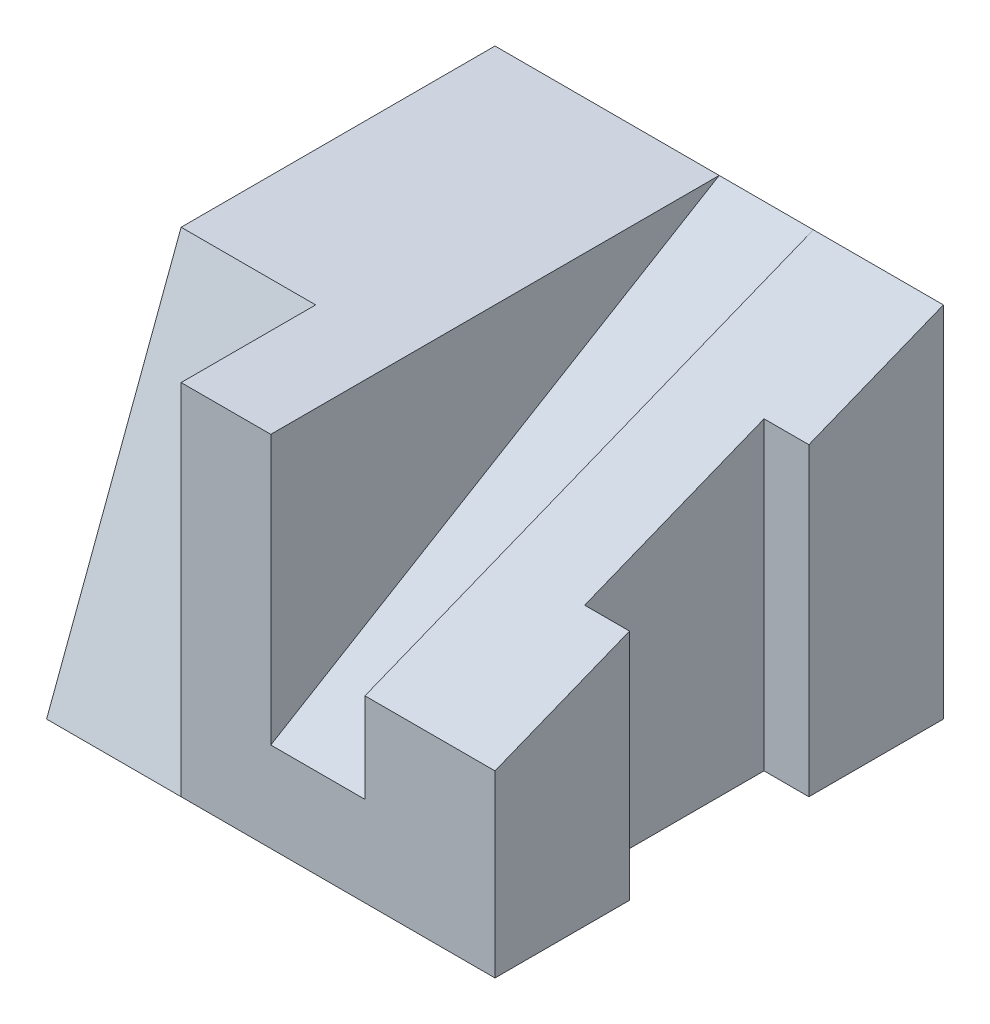
ISO-10303-21;
HEADER;
FILE_DESCRIPTION(('STEP AP214'),'2;1');
FILE_NAME('part.step','',(''),(''),'','','');
FILE_SCHEMA(('AUTOMOTIVE_DESIGN { 1 0 10303 214 1 1 1 1 }'));
ENDSEC;
DATA;
#1=APPLICATION_CONTEXT('core data for automotive mechanical design processes');
#2=APPLICATION_PROTOCOL_DEFINITION('international standard','automotive_design',2000,#1);
#3=PRODUCT_CONTEXT('',#1,'mechanical');
#4=PRODUCT('Part','Part','',(#3));
#5=PRODUCT_RELATED_PRODUCT_CATEGORY('part','',(#4));
#6=PRODUCT_DEFINITION_FORMATION('','',#4);
#7=PRODUCT_DEFINITION_CONTEXT('part definition',#1,'design');
#8=PRODUCT_DEFINITION('design','',#6,#7);
#9=PRODUCT_DEFINITION_SHAPE('','',#8);
#10=(LENGTH_UNIT() NAMED_UNIT(*) SI_UNIT(.MILLI.,.METRE.));
#11=(NAMED_UNIT(*) PLANE_ANGLE_UNIT() SI_UNIT($,.RADIAN.));
#12=(NAMED_UNIT(*) SI_UNIT($,.STERADIAN.) SOLID_ANGLE_UNIT());
#13=UNCERTAINTY_MEASURE_WITH_UNIT(LENGTH_MEASURE(1.E-05),#10,'distance_accuracy_value','');
#14=(GEOMETRIC_REPRESENTATION_CONTEXT(3) GLOBAL_UNCERTAINTY_ASSIGNED_CONTEXT((#13)) GLOBAL_UNIT_ASSIGNED_CONTEXT((#10,
#11,#12)) REPRESENTATION_CONTEXT('',''));
#15=CARTESIAN_POINT('',(0.,0.,0.));
#16=DIRECTION('',(0.,0.,1.));
#17=DIRECTION('',(1.,0.,0.));
#18=AXIS2_PLACEMENT_3D('',#15,#16,#17);
#19=CARTESIAN_POINT('',(100.,0.,-100.));
#20=DIRECTION('',(1.,0.,0.));
#21=DIRECTION('',(0.,0.,-1.));
#22=AXIS2_PLACEMENT_3D('',#19,#20,#21);
#23=PLANE('',#22);
#24=DIRECTION('',(0.,1.,0.));
#25=VECTOR('',#24,1.);
#26=CARTESIAN_POINT('',(100.,0.,-70.));
#27=LINE('',#26,#25);
#28=CARTESIAN_POINT('',(100.,0.,-70.));
#29=VERTEX_POINT('',#28);
#30=CARTESIAN_POINT('',(100.,68.,-70.));
#31=VERTEX_POINT('',#30);
#32=EDGE_CURVE('E154',#29,#31,#27,.T.);
#33=ORIENTED_EDGE('',*,*,#32,.F.);
#34=DIRECTION('',(0.,0.,1.));
#35=VECTOR('',#34,1.);
#36=CARTESIAN_POINT('',(100.,0.,-100.));
#37=LINE('',#36,#35);
#38=CARTESIAN_POINT('',(100.,0.,-100.));
#39=VERTEX_POINT('',#38);
#40=EDGE_CURVE('E51',#39,#29,#37,.T.);
#41=ORIENTED_EDGE('',*,*,#40,.F.);
#42=DIRECTION('',(0.,1.,0.));
#43=VECTOR('',#42,1.);
#44=CARTESIAN_POINT('',(100.,0.,-100.));
#45=LINE('',#44,#43);
#46=CARTESIAN_POINT('',(100.,80.,-100.));
#47=VERTEX_POINT('',#46);
#48=EDGE_CURVE('E228',#39,#47,#45,.T.);
#49=ORIENTED_EDGE('',*,*,#48,.T.);
#50=DIRECTION('',(0.,0.371390676354104,-0.928476690885259));
#51=VECTOR('',#50,1.);
#52=CARTESIAN_POINT('',(100.,40.,0.));
#53=LINE('',#52,#51);
#54=EDGE_CURVE('E192',#31,#47,#53,.T.);
#55=ORIENTED_EDGE('',*,*,#54,.F.);
#56=EDGE_LOOP('',(#33,#41,#49,#55));
#57=FACE_BOUND('',#56,.T.);
#58=ADVANCED_FACE('F41',(#57),#23,.T.);
#59=CARTESIAN_POINT('',(0.,0.,0.));
#60=DIRECTION('',(0.,0.,-1.));
#61=DIRECTION('',(-1.,0.,0.));
#62=AXIS2_PLACEMENT_3D('',#59,#60,#61);
#63=PLANE('',#62);
#64=DIRECTION('',(0.,-1.,0.));
#65=VECTOR('',#64,1.);
#66=CARTESIAN_POINT('',(71.,40.,0.));
#67=LINE('',#66,#65);
#68=CARTESIAN_POINT('',(71.,40.,0.));
#69=VERTEX_POINT('',#68);
#70=CARTESIAN_POINT('',(71.,20.,0.));
#71=VERTEX_POINT('',#70);
#72=EDGE_CURVE('E172',#69,#71,#67,.T.);
#73=ORIENTED_EDGE('',*,*,#72,.T.);
#74=DIRECTION('',(-1.,0.,0.));
#75=VECTOR('',#74,1.);
#76=CARTESIAN_POINT('',(71.,20.,0.));
#77=LINE('',#76,#75);
#78=CARTESIAN_POINT('',(50.,20.,0.));
#79=VERTEX_POINT('',#78);
#80=EDGE_CURVE('E188',#71,#79,#77,.T.);
#81=ORIENTED_EDGE('',*,*,#80,.T.);
#82=DIRECTION('',(0.,-1.,0.));
#83=VECTOR('',#82,1.);
#84=CARTESIAN_POINT('',(50.,80.,0.));
#85=LINE('',#84,#83);
#86=CARTESIAN_POINT('',(50.,80.,0.));
#87=VERTEX_POINT('',#86);
#88=EDGE_CURVE('E193',#87,#79,#85,.T.);
#89=ORIENTED_EDGE('',*,*,#88,.F.);
#90=DIRECTION('',(-1.,0.,0.));
#91=VECTOR('',#90,1.);
#92=CARTESIAN_POINT('',(0.,80.,0.));
#93=LINE('',#92,#91);
#94=CARTESIAN_POINT('',(30.,80.,0.));
#95=VERTEX_POINT('',#94);
#96=EDGE_CURVE('E224',#87,#95,#93,.T.);
#97=ORIENTED_EDGE('',*,*,#96,.T.);
#98=DIRECTION('',(0.,1.,0.));
#99=VECTOR('',#98,1.);
#100=CARTESIAN_POINT('',(30.,80.,0.));
#101=LINE('',#100,#99);
#102=CARTESIAN_POINT('',(30.,0.,0.));
#103=VERTEX_POINT('',#102);
#104=EDGE_CURVE('E205',#103,#95,#101,.T.);
#105=ORIENTED_EDGE('',*,*,#104,.F.);
#106=DIRECTION('',(1.,0.,0.));
#107=VECTOR('',#106,1.);
#108=CARTESIAN_POINT('',(0.,0.,0.));
#109=LINE('',#108,#107);
#110=CARTESIAN_POINT('',(100.,0.,0.));
#111=VERTEX_POINT('',#110);
#112=EDGE_CURVE('E218',#103,#111,#109,.T.);
#113=ORIENTED_EDGE('',*,*,#112,.T.);
#114=DIRECTION('',(0.,1.,0.));
#115=VECTOR('',#114,1.);
#116=CARTESIAN_POINT('',(100.,0.,0.));
#117=LINE('',#116,#115);
#118=CARTESIAN_POINT('',(100.,40.,0.));
#119=VERTEX_POINT('',#118);
#120=EDGE_CURVE('E240',#111,#119,#117,.T.);
#121=ORIENTED_EDGE('',*,*,#120,.T.);
#122=DIRECTION('',(1.,0.,0.));
#123=VECTOR('',#122,1.);
#124=CARTESIAN_POINT('',(50.,40.,0.));
#125=LINE('',#124,#123);
#126=EDGE_CURVE('E199',#69,#119,#125,.T.);
#127=ORIENTED_EDGE('',*,*,#126,.F.);
#128=EDGE_LOOP('',(#73,#81,#89,#97,#105,#113,#121,#127));
#129=FACE_BOUND('',#128,.T.);
#130=ADVANCED_FACE('F268',(#129),#63,.F.);
#131=CARTESIAN_POINT('',(50.,40.,0.));
#132=DIRECTION('',(0.,-0.928476690885259,-0.371390676354104));
#133=DIRECTION('',(0.,0.371390676354104,-0.92847669088526));
#134=AXIS2_PLACEMENT_3D('',#131,#132,#133);
#135=PLANE('',#134);
#136=DIRECTION('',(0.,-0.371390676354104,0.928476690885259));
#137=VECTOR('',#136,1.);
#138=CARTESIAN_POINT('',(90.,68.,-70.));
#139=LINE('',#138,#137);
#140=CARTESIAN_POINT('',(90.,68.,-70.));
#141=VERTEX_POINT('',#140);
#142=CARTESIAN_POINT('',(90.,52.,-30.));
#143=VERTEX_POINT('',#142);
#144=EDGE_CURVE('E144',#141,#143,#139,.T.);
#145=ORIENTED_EDGE('',*,*,#144,.F.);
#146=DIRECTION('',(1.,0.,0.));
#147=VECTOR('',#146,1.);
#148=CARTESIAN_POINT('',(90.,68.,-70.));
#149=LINE('',#148,#147);
#150=EDGE_CURVE('E173',#141,#31,#149,.T.);
#151=ORIENTED_EDGE('',*,*,#150,.T.);
#152=ORIENTED_EDGE('',*,*,#54,.T.);
#153=DIRECTION('',(-1.,0.,0.));
#154=VECTOR('',#153,1.);
#155=CARTESIAN_POINT('',(0.,80.,-100.));
#156=LINE('',#155,#154);
#157=CARTESIAN_POINT('',(71.,80.,-100.));
#158=VERTEX_POINT('',#157);
#159=EDGE_CURVE('E233',#47,#158,#156,.T.);
#160=ORIENTED_EDGE('',*,*,#159,.T.);
#161=DIRECTION('',(0.,-0.371390676354104,0.928476690885259));
#162=VECTOR('',#161,1.);
#163=CARTESIAN_POINT('',(71.,80.,-100.));
#164=LINE('',#163,#162);
#165=EDGE_CURVE('E180',#158,#69,#164,.T.);
#166=ORIENTED_EDGE('',*,*,#165,.T.);
#167=ORIENTED_EDGE('',*,*,#126,.T.);
#168=CARTESIAN_POINT('',(100.,52.,-30.));
#169=VERTEX_POINT('',#168);
#170=EDGE_CURVE('E159',#119,#169,#53,.T.);
#171=ORIENTED_EDGE('',*,*,#170,.T.);
#172=DIRECTION('',(1.,0.,0.));
#173=VECTOR('',#172,1.);
#174=CARTESIAN_POINT('',(90.,52.,-30.));
#175=LINE('',#174,#173);
#176=EDGE_CURVE('E137',#143,#169,#175,.T.);
#177=ORIENTED_EDGE('',*,*,#176,.F.);
#178=EDGE_LOOP('',(#145,#151,#152,#160,#166,#167,#171,#177));
#179=FACE_BOUND('',#178,.T.);
#180=ADVANCED_FACE('F157',(#179),#135,.F.);
#181=CARTESIAN_POINT('',(0.,0.,-100.));
#182=DIRECTION('',(-1.,0.,0.));
#183=DIRECTION('',(0.,0.,1.));
#184=AXIS2_PLACEMENT_3D('',#181,#182,#183);
#185=PLANE('',#184);
#186=DIRECTION('',(0.,-0.936329177569045,0.351123441588392));
#187=VECTOR('',#186,1.);
#188=CARTESIAN_POINT('',(0.,0.,0.));
#189=LINE('',#188,#187);
#190=CARTESIAN_POINT('',(0.,80.,-30.));
#191=VERTEX_POINT('',#190);
#192=CARTESIAN_POINT('',(0.,0.,0.));
#193=VERTEX_POINT('',#192);
#194=EDGE_CURVE('E204',#191,#193,#189,.T.);
#195=ORIENTED_EDGE('',*,*,#194,.F.);
#196=DIRECTION('',(0.,0.,1.));
#197=VECTOR('',#196,1.);
#198=CARTESIAN_POINT('',(0.,80.,-100.));
#199=LINE('',#198,#197);
#200=CARTESIAN_POINT('',(0.,80.,-100.));
#201=VERTEX_POINT('',#200);
#202=EDGE_CURVE('E11',#201,#191,#199,.T.);
#203=ORIENTED_EDGE('',*,*,#202,.F.);
#204=DIRECTION('',(0.,-1.,0.));
#205=VECTOR('',#204,1.);
#206=CARTESIAN_POINT('',(0.,0.,-100.));
#207=LINE('',#206,#205);
#208=CARTESIAN_POINT('',(0.,0.,-100.));
#209=VERTEX_POINT('',#208);
#210=EDGE_CURVE('E219',#201,#209,#207,.T.);
#211=ORIENTED_EDGE('',*,*,#210,.T.);
#212=DIRECTION('',(0.,0.,1.));
#213=VECTOR('',#212,1.);
#214=CARTESIAN_POINT('',(0.,0.,-100.));
#215=LINE('',#214,#213);
#216=EDGE_CURVE('E45',#209,#193,#215,.T.);
#217=ORIENTED_EDGE('',*,*,#216,.T.);
#218=EDGE_LOOP('',(#195,#203,#211,#217));
#219=FACE_BOUND('',#218,.T.);
#220=ADVANCED_FACE('F43',(#219),#185,.T.);
#221=CARTESIAN_POINT('',(0.,80.,-100.));
#222=DIRECTION('',(0.,1.,0.));
#223=DIRECTION('',(0.,0.,1.));
#224=AXIS2_PLACEMENT_3D('',#221,#222,#223);
#225=PLANE('',#224);
#226=DIRECTION('',(0.,0.,1.));
#227=VECTOR('',#226,1.);
#228=CARTESIAN_POINT('',(50.,80.,-100.));
#229=LINE('',#228,#227);
#230=CARTESIAN_POINT('',(50.,80.,-100.));
#231=VERTEX_POINT('',#230);
#232=EDGE_CURVE('E196',#231,#87,#229,.T.);
#233=ORIENTED_EDGE('',*,*,#232,.F.);
#234=EDGE_CURVE('E232',#231,#201,#156,.T.);
#235=ORIENTED_EDGE('',*,*,#234,.T.);
#236=ORIENTED_EDGE('',*,*,#202,.T.);
#237=DIRECTION('',(-1.,0.,0.));
#238=VECTOR('',#237,1.);
#239=CARTESIAN_POINT('',(30.,80.,-30.));
#240=LINE('',#239,#238);
#241=CARTESIAN_POINT('',(30.,80.,-30.));
#242=VERTEX_POINT('',#241);
#243=EDGE_CURVE('E213',#242,#191,#240,.T.);
#244=ORIENTED_EDGE('',*,*,#243,.F.);
#245=DIRECTION('',(0.,0.,-1.));
#246=VECTOR('',#245,1.);
#247=CARTESIAN_POINT('',(30.,80.,-30.));
#248=LINE('',#247,#246);
#249=EDGE_CURVE('E208',#95,#242,#248,.T.);
#250=ORIENTED_EDGE('',*,*,#249,.F.);
#251=ORIENTED_EDGE('',*,*,#96,.F.);
#252=EDGE_LOOP('',(#233,#235,#236,#244,#250,#251));
#253=FACE_BOUND('',#252,.T.);
#254=ADVANCED_FACE('F276',(#253),#225,.T.);
#255=DIRECTION('',(0.,-1.,0.));
#256=VECTOR('',#255,1.);
#257=CARTESIAN_POINT('',(100.,52.,-30.));
#258=LINE('',#257,#256);
#259=CARTESIAN_POINT('',(100.,0.,-30.));
#260=VERTEX_POINT('',#259);
#261=EDGE_CURVE('E288',#169,#260,#258,.T.);
#262=ORIENTED_EDGE('',*,*,#261,.F.);
#263=ORIENTED_EDGE('',*,*,#170,.F.);
#264=ORIENTED_EDGE('',*,*,#120,.F.);
#265=EDGE_CURVE('E247',#260,#111,#37,.T.);
#266=ORIENTED_EDGE('',*,*,#265,.F.);
#267=EDGE_LOOP('',(#262,#263,#264,#266));
#268=FACE_BOUND('',#267,.T.);
#269=ADVANCED_FACE('F299',(#268),#23,.T.);
#270=CARTESIAN_POINT('',(0.,0.,-100.));
#271=DIRECTION('',(0.,-1.,0.));
#272=DIRECTION('',(0.,0.,-1.));
#273=AXIS2_PLACEMENT_3D('',#270,#271,#272);
#274=PLANE('',#273);
#275=DIRECTION('',(1.,0.,0.));
#276=VECTOR('',#275,1.);
#277=CARTESIAN_POINT('',(90.,0.,-70.));
#278=LINE('',#277,#276);
#279=CARTESIAN_POINT('',(90.,0.,-70.));
#280=VERTEX_POINT('',#279);
#281=EDGE_CURVE('E164',#280,#29,#278,.T.);
#282=ORIENTED_EDGE('',*,*,#281,.F.);
#283=DIRECTION('',(0.,0.,-1.));
#284=VECTOR('',#283,1.);
#285=CARTESIAN_POINT('',(90.,0.,-30.));
#286=LINE('',#285,#284);
#287=CARTESIAN_POINT('',(90.,0.,-30.));
#288=VERTEX_POINT('',#287);
#289=EDGE_CURVE('E143',#288,#280,#286,.T.);
#290=ORIENTED_EDGE('',*,*,#289,.F.);
#291=DIRECTION('',(1.,0.,0.));
#292=VECTOR('',#291,1.);
#293=CARTESIAN_POINT('',(90.,0.,-30.));
#294=LINE('',#293,#292);
#295=EDGE_CURVE('E140',#288,#260,#294,.T.);
#296=ORIENTED_EDGE('',*,*,#295,.T.);
#297=ORIENTED_EDGE('',*,*,#265,.T.);
#298=ORIENTED_EDGE('',*,*,#112,.F.);
#299=EDGE_CURVE('E237',#193,#103,#109,.T.);
#300=ORIENTED_EDGE('',*,*,#299,.F.);
#301=ORIENTED_EDGE('',*,*,#216,.F.);
#302=DIRECTION('',(1.,0.,0.));
#303=VECTOR('',#302,1.);
#304=CARTESIAN_POINT('',(0.,0.,-100.));
#305=LINE('',#304,#303);
#306=EDGE_CURVE('E223',#209,#39,#305,.T.);
#307=ORIENTED_EDGE('',*,*,#306,.T.);
#308=ORIENTED_EDGE('',*,*,#40,.T.);
#309=EDGE_LOOP('',(#282,#290,#296,#297,#298,#300,#301,#307,#308));
#310=FACE_BOUND('',#309,.T.);
#311=ADVANCED_FACE('F262',(#310),#274,.T.);
#312=CARTESIAN_POINT('',(0.,0.,-100.));
#313=DIRECTION('',(0.,0.,-1.));
#314=DIRECTION('',(-1.,0.,0.));
#315=AXIS2_PLACEMENT_3D('',#312,#313,#314);
#316=PLANE('',#315);
#317=ORIENTED_EDGE('',*,*,#210,.F.);
#318=ORIENTED_EDGE('',*,*,#234,.F.);
#319=DIRECTION('',(-1.,0.,0.));
#320=VECTOR('',#319,1.);
#321=CARTESIAN_POINT('',(71.,80.,-100.));
#322=LINE('',#321,#320);
#323=EDGE_CURVE('E184',#158,#231,#322,.T.);
#324=ORIENTED_EDGE('',*,*,#323,.F.);
#325=ORIENTED_EDGE('',*,*,#159,.F.);
#326=ORIENTED_EDGE('',*,*,#48,.F.);
#327=ORIENTED_EDGE('',*,*,#306,.F.);
#328=EDGE_LOOP('',(#317,#318,#324,#325,#326,#327));
#329=FACE_BOUND('',#328,.T.);
#330=ADVANCED_FACE('F279',(#329),#316,.T.);
#331=CARTESIAN_POINT('',(30.,0.,0.));
#332=DIRECTION('',(0.,-0.351123441588392,-0.936329177569045));
#333=DIRECTION('',(0.,0.936329177569045,-0.351123441588392));
#334=AXIS2_PLACEMENT_3D('',#331,#332,#333);
#335=PLANE('',#334);
#336=ORIENTED_EDGE('',*,*,#194,.T.);
#337=ORIENTED_EDGE('',*,*,#299,.T.);
#338=DIRECTION('',(0.,-0.936329177569045,0.351123441588392));
#339=VECTOR('',#338,1.);
#340=CARTESIAN_POINT('',(30.,0.,0.));
#341=LINE('',#340,#339);
#342=EDGE_CURVE('E67',#242,#103,#341,.T.);
#343=ORIENTED_EDGE('',*,*,#342,.F.);
#344=ORIENTED_EDGE('',*,*,#243,.T.);
#345=EDGE_LOOP('',(#336,#337,#343,#344));
#346=FACE_BOUND('',#345,.T.);
#347=ADVANCED_FACE('F265',(#346),#335,.F.);
#348=CARTESIAN_POINT('',(30.,0.,0.));
#349=DIRECTION('',(-1.,0.,0.));
#350=DIRECTION('',(0.,0.,1.));
#351=AXIS2_PLACEMENT_3D('',#348,#349,#350);
#352=PLANE('',#351);
#353=ORIENTED_EDGE('',*,*,#104,.T.);
#354=ORIENTED_EDGE('',*,*,#249,.T.);
#355=ORIENTED_EDGE('',*,*,#342,.T.);
#356=EDGE_LOOP('',(#353,#354,#355));
#357=FACE_BOUND('',#356,.T.);
#358=ADVANCED_FACE('F273',(#357),#352,.T.);
#359=CARTESIAN_POINT('',(50.,0.,0.));
#360=DIRECTION('',(-1.,0.,0.));
#361=DIRECTION('',(0.,0.,1.));
#362=AXIS2_PLACEMENT_3D('',#359,#360,#361);
#363=PLANE('',#362);
#364=ORIENTED_EDGE('',*,*,#88,.T.);
#365=DIRECTION('',(0.,0.514495755427526,-0.857492925712544));
#366=VECTOR('',#365,1.);
#367=CARTESIAN_POINT('',(50.,20.,0.));
#368=LINE('',#367,#366);
#369=EDGE_CURVE('E169',#79,#231,#368,.T.);
#370=ORIENTED_EDGE('',*,*,#369,.T.);
#371=ORIENTED_EDGE('',*,*,#232,.T.);
#372=EDGE_LOOP('',(#364,#370,#371));
#373=FACE_BOUND('',#372,.T.);
#374=ADVANCED_FACE('F309',(#373),#363,.F.);
#375=CARTESIAN_POINT('',(71.,20.,0.));
#376=DIRECTION('',(0.,0.857492925712544,0.514495755427526));
#377=DIRECTION('',(0.,-0.514495755427526,0.857492925712544));
#378=AXIS2_PLACEMENT_3D('',#375,#376,#377);
#379=PLANE('',#378);
#380=ORIENTED_EDGE('',*,*,#80,.F.);
#381=DIRECTION('',(0.,0.514495755427526,-0.857492925712544));
#382=VECTOR('',#381,1.);
#383=CARTESIAN_POINT('',(71.,20.,0.));
#384=LINE('',#383,#382);
#385=EDGE_CURVE('E177',#71,#158,#384,.T.);
#386=ORIENTED_EDGE('',*,*,#385,.T.);
#387=ORIENTED_EDGE('',*,*,#323,.T.);
#388=ORIENTED_EDGE('',*,*,#369,.F.);
#389=EDGE_LOOP('',(#380,#386,#387,#388));
#390=FACE_BOUND('',#389,.T.);
#391=ADVANCED_FACE('F307',(#390),#379,.T.);
#392=CARTESIAN_POINT('',(71.,0.,0.));
#393=DIRECTION('',(-1.,0.,0.));
#394=DIRECTION('',(0.,0.,1.));
#395=AXIS2_PLACEMENT_3D('',#392,#393,#394);
#396=PLANE('',#395);
#397=ORIENTED_EDGE('',*,*,#72,.F.);
#398=ORIENTED_EDGE('',*,*,#165,.F.);
#399=ORIENTED_EDGE('',*,*,#385,.F.);
#400=EDGE_LOOP('',(#397,#398,#399));
#401=FACE_BOUND('',#400,.T.);
#402=ADVANCED_FACE('F303',(#401),#396,.T.);
#403=CARTESIAN_POINT('',(90.,0.,-70.));
#404=DIRECTION('',(0.,0.,-1.));
#405=DIRECTION('',(-1.,0.,0.));
#406=AXIS2_PLACEMENT_3D('',#403,#404,#405);
#407=PLANE('',#406);
#408=ORIENTED_EDGE('',*,*,#32,.T.);
#409=ORIENTED_EDGE('',*,*,#150,.F.);
#410=DIRECTION('',(0.,1.,0.));
#411=VECTOR('',#410,1.);
#412=CARTESIAN_POINT('',(90.,0.,-70.));
#413=LINE('',#412,#411);
#414=EDGE_CURVE('E150',#280,#141,#413,.T.);
#415=ORIENTED_EDGE('',*,*,#414,.F.);
#416=ORIENTED_EDGE('',*,*,#281,.T.);
#417=EDGE_LOOP('',(#408,#409,#415,#416));
#418=FACE_BOUND('',#417,.T.);
#419=ADVANCED_FACE('F295',(#418),#407,.F.);
#420=CARTESIAN_POINT('',(90.,52.,-30.));
#421=DIRECTION('',(0.,0.,1.));
#422=DIRECTION('',(0.,-1.,0.));
#423=AXIS2_PLACEMENT_3D('',#420,#421,#422);
#424=PLANE('',#423);
#425=ORIENTED_EDGE('',*,*,#261,.T.);
#426=ORIENTED_EDGE('',*,*,#295,.F.);
#427=DIRECTION('',(0.,-1.,0.));
#428=VECTOR('',#427,1.);
#429=CARTESIAN_POINT('',(90.,52.,-30.));
#430=LINE('',#429,#428);
#431=EDGE_CURVE('E59',#143,#288,#430,.T.);
#432=ORIENTED_EDGE('',*,*,#431,.F.);
#433=ORIENTED_EDGE('',*,*,#176,.T.);
#434=EDGE_LOOP('',(#425,#426,#432,#433));
#435=FACE_BOUND('',#434,.T.);
#436=ADVANCED_FACE('F135',(#435),#424,.F.);
#437=CARTESIAN_POINT('',(90.,0.,0.));
#438=DIRECTION('',(1.,0.,0.));
#439=DIRECTION('',(0.,0.,-1.));
#440=AXIS2_PLACEMENT_3D('',#437,#438,#439);
#441=PLANE('',#440);
#442=ORIENTED_EDGE('',*,*,#144,.T.);
#443=ORIENTED_EDGE('',*,*,#431,.T.);
#444=ORIENTED_EDGE('',*,*,#289,.T.);
#445=ORIENTED_EDGE('',*,*,#414,.T.);
#446=EDGE_LOOP('',(#442,#443,#444,#445));
#447=FACE_BOUND('',#446,.T.);
#448=ADVANCED_FACE('F148',(#447),#441,.T.);
#449=CLOSED_SHELL('',(#58,#130,#180,#220,#254,#269,#311,#330,#347,#358,#374,#391,#402,#419,#436,#448));
#450=MANIFOLD_SOLID_BREP('B2',#449);
#451=ADVANCED_BREP_SHAPE_REPRESENTATION('',(#18,#450),#14);
#452=SHAPE_DEFINITION_REPRESENTATION(#9,#451);
ENDSEC;
END-ISO-10303-21;
